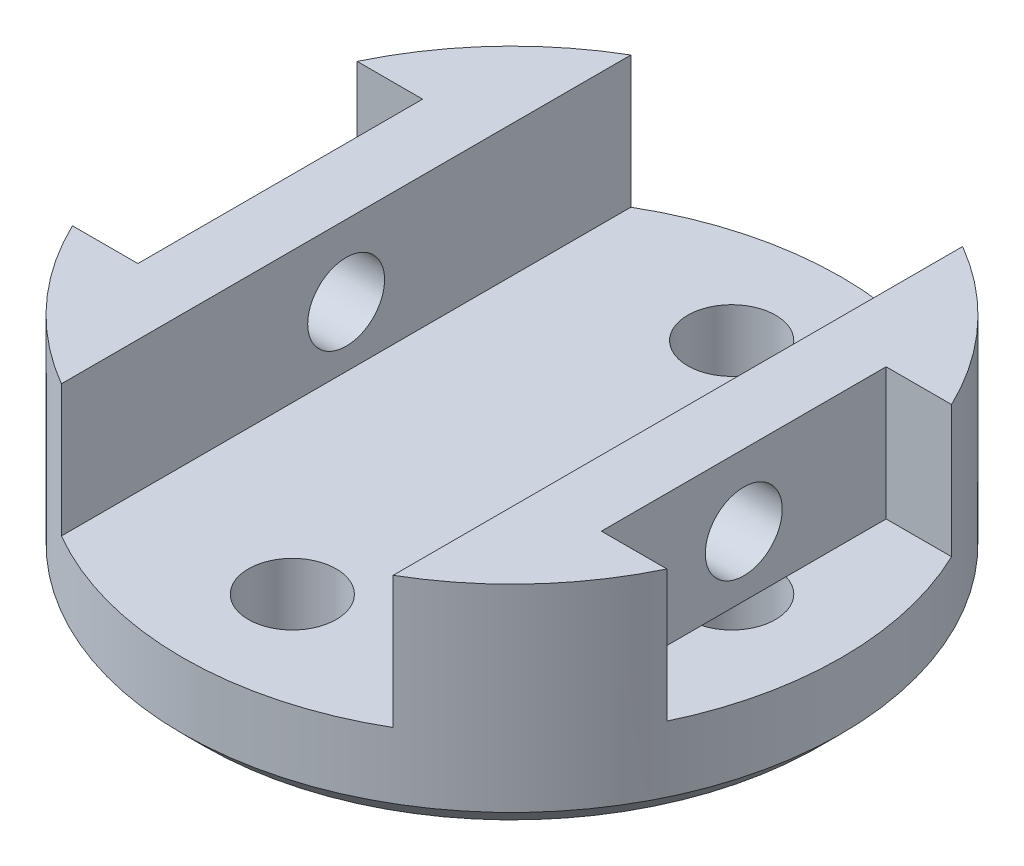
ISO-10303-21;
HEADER;
FILE_DESCRIPTION(('STEP AP214'),'2;1');
FILE_NAME('part.step','',(''),(''),'','','');
FILE_SCHEMA(('AUTOMOTIVE_DESIGN { 1 0 10303 214 1 1 1 1 }'));
ENDSEC;
DATA;
#1=APPLICATION_CONTEXT('core data for automotive mechanical design processes');
#2=APPLICATION_PROTOCOL_DEFINITION('international standard','automotive_design',2000,#1);
#3=PRODUCT_CONTEXT('',#1,'mechanical');
#4=PRODUCT('Part','Part','',(#3));
#5=PRODUCT_RELATED_PRODUCT_CATEGORY('part','',(#4));
#6=PRODUCT_DEFINITION_FORMATION('','',#4);
#7=PRODUCT_DEFINITION_CONTEXT('part definition',#1,'design');
#8=PRODUCT_DEFINITION('design','',#6,#7);
#9=PRODUCT_DEFINITION_SHAPE('','',#8);
#10=(LENGTH_UNIT() NAMED_UNIT(*) SI_UNIT(.MILLI.,.METRE.));
#11=(NAMED_UNIT(*) PLANE_ANGLE_UNIT() SI_UNIT($,.RADIAN.));
#12=(NAMED_UNIT(*) SI_UNIT($,.STERADIAN.) SOLID_ANGLE_UNIT());
#13=UNCERTAINTY_MEASURE_WITH_UNIT(LENGTH_MEASURE(1.E-05),#10,'distance_accuracy_value','');
#14=(GEOMETRIC_REPRESENTATION_CONTEXT(3) GLOBAL_UNCERTAINTY_ASSIGNED_CONTEXT((#13)) GLOBAL_UNIT_ASSIGNED_CONTEXT((#10,
#11,#12)) REPRESENTATION_CONTEXT('',''));
#15=CARTESIAN_POINT('',(0.,0.,0.));
#16=DIRECTION('',(0.,0.,1.));
#17=DIRECTION('',(1.,0.,0.));
#18=AXIS2_PLACEMENT_3D('',#15,#16,#17);
#19=CARTESIAN_POINT('',(0.,4.,0.));
#20=DIRECTION('',(0.,-1.,0.));
#21=DIRECTION('',(0.,0.,-1.));
#22=AXIS2_PLACEMENT_3D('',#19,#20,#21);
#23=CYLINDRICAL_SURFACE('',#22,15.);
#24=CARTESIAN_POINT('',(0.,1.00000000000001,0.));
#25=DIRECTION('',(0.,1.,0.));
#26=DIRECTION('',(0.,0.,1.));
#27=AXIS2_PLACEMENT_3D('',#24,#25,#26);
#28=CIRCLE('',#27,15.);
#29=CARTESIAN_POINT('',(0.,1.00000000000001,15.));
#30=VERTEX_POINT('',#29);
#31=EDGE_CURVE('E239',#30,#30,#28,.T.);
#32=ORIENTED_EDGE('',*,*,#31,.T.);
#33=EDGE_LOOP('',(#32));
#34=FACE_BOUND('',#33,.T.);
#35=CARTESIAN_POINT('',(0.,10.,0.));
#36=DIRECTION('',(0.,1.,0.));
#37=DIRECTION('',(0.,0.,1.));
#38=AXIS2_PLACEMENT_3D('',#35,#36,#37);
#39=CIRCLE('',#38,15.);
#40=CARTESIAN_POINT('',(7.55,10.,12.9613849568632));
#41=VERTEX_POINT('',#40);
#42=CARTESIAN_POINT('',(13.5277723591137,10.,6.4806924784316));
#43=VERTEX_POINT('',#42);
#44=EDGE_CURVE('E280',#41,#43,#39,.T.);
#45=ORIENTED_EDGE('',*,*,#44,.F.);
#46=DIRECTION('',(0.,-1.,0.));
#47=VECTOR('',#46,1.);
#48=CARTESIAN_POINT('',(7.55,14.,12.9613849568632));
#49=LINE('',#48,#47);
#50=CARTESIAN_POINT('',(7.55,4.,12.9613849568632));
#51=VERTEX_POINT('',#50);
#52=EDGE_CURVE('E209',#41,#51,#49,.T.);
#53=ORIENTED_EDGE('',*,*,#52,.T.);
#54=CARTESIAN_POINT('',(0.,4.,0.));
#55=DIRECTION('',(0.,1.,0.));
#56=DIRECTION('',(0.,0.,1.));
#57=AXIS2_PLACEMENT_3D('',#54,#55,#56);
#58=CIRCLE('',#57,15.);
#59=CARTESIAN_POINT('',(-7.55,4.,12.9613849568632));
#60=VERTEX_POINT('',#59);
#61=EDGE_CURVE('E236',#60,#51,#58,.T.);
#62=ORIENTED_EDGE('',*,*,#61,.F.);
#63=DIRECTION('',(0.,-1.,0.));
#64=VECTOR('',#63,1.);
#65=CARTESIAN_POINT('',(-7.55,14.,12.9613849568632));
#66=LINE('',#65,#64);
#67=CARTESIAN_POINT('',(-7.55,10.,12.9613849568632));
#68=VERTEX_POINT('',#67);
#69=EDGE_CURVE('E223',#68,#60,#66,.T.);
#70=ORIENTED_EDGE('',*,*,#69,.F.);
#71=CARTESIAN_POINT('',(-13.5277723591137,10.,6.4806924784316));
#72=VERTEX_POINT('',#71);
#73=EDGE_CURVE('E276',#72,#68,#39,.T.);
#74=ORIENTED_EDGE('',*,*,#73,.F.);
#75=DIRECTION('',(0.,-1.,0.));
#76=VECTOR('',#75,1.);
#77=CARTESIAN_POINT('',(-13.5277723591137,4.,6.4806924784316));
#78=LINE('',#77,#76);
#79=CARTESIAN_POINT('',(-13.5277723591137,4.,6.4806924784316));
#80=VERTEX_POINT('',#79);
#81=EDGE_CURVE('E155',#72,#80,#78,.T.);
#82=ORIENTED_EDGE('',*,*,#81,.T.);
#83=CARTESIAN_POINT('',(0.,4.,0.));
#84=DIRECTION('',(0.,-1.,0.));
#85=DIRECTION('',(0.,0.,-1.));
#86=AXIS2_PLACEMENT_3D('',#83,#84,#85);
#87=CIRCLE('',#86,15.);
#88=CARTESIAN_POINT('',(-13.5277723591137,4.,-6.48069247843161));
#89=VERTEX_POINT('',#88);
#90=EDGE_CURVE('E52',#80,#89,#87,.T.);
#91=ORIENTED_EDGE('',*,*,#90,.T.);
#92=DIRECTION('',(0.,-1.,0.));
#93=VECTOR('',#92,1.);
#94=CARTESIAN_POINT('',(-13.5277723591137,4.,-6.48069247843161));
#95=LINE('',#94,#93);
#96=CARTESIAN_POINT('',(-13.5277723591137,10.,-6.48069247843161));
#97=VERTEX_POINT('',#96);
#98=EDGE_CURVE('E178',#89,#97,#95,.F.);
#99=ORIENTED_EDGE('',*,*,#98,.T.);
#100=CARTESIAN_POINT('',(-7.55,10.,-12.9613849568632));
#101=VERTEX_POINT('',#100);
#102=EDGE_CURVE('E278',#101,#97,#39,.T.);
#103=ORIENTED_EDGE('',*,*,#102,.F.);
#104=DIRECTION('',(0.,-1.,0.));
#105=VECTOR('',#104,1.);
#106=CARTESIAN_POINT('',(-7.55,14.,-12.9613849568632));
#107=LINE('',#106,#105);
#108=CARTESIAN_POINT('',(-7.55,4.,-12.9613849568632));
#109=VERTEX_POINT('',#108);
#110=EDGE_CURVE('E221',#101,#109,#107,.T.);
#111=ORIENTED_EDGE('',*,*,#110,.T.);
#112=CARTESIAN_POINT('',(7.55,4.,-12.9613849568632));
#113=VERTEX_POINT('',#112);
#114=EDGE_CURVE('E240',#113,#109,#58,.T.);
#115=ORIENTED_EDGE('',*,*,#114,.F.);
#116=DIRECTION('',(0.,-1.,0.));
#117=VECTOR('',#116,1.);
#118=CARTESIAN_POINT('',(7.55,14.,-12.9613849568632));
#119=LINE('',#118,#117);
#120=CARTESIAN_POINT('',(7.55,10.,-12.9613849568632));
#121=VERTEX_POINT('',#120);
#122=EDGE_CURVE('E207',#121,#113,#119,.T.);
#123=ORIENTED_EDGE('',*,*,#122,.F.);
#124=CARTESIAN_POINT('',(13.5277723591137,10.,-6.48069247843161));
#125=VERTEX_POINT('',#124);
#126=EDGE_CURVE('E288',#125,#121,#39,.T.);
#127=ORIENTED_EDGE('',*,*,#126,.F.);
#128=DIRECTION('',(0.,-1.,0.));
#129=VECTOR('',#128,1.);
#130=CARTESIAN_POINT('',(13.5277723591137,4.,-6.48069247843161));
#131=LINE('',#130,#129);
#132=CARTESIAN_POINT('',(13.5277723591137,4.,-6.48069247843161));
#133=VERTEX_POINT('',#132);
#134=EDGE_CURVE('E200',#133,#125,#131,.F.);
#135=ORIENTED_EDGE('',*,*,#134,.F.);
#136=CARTESIAN_POINT('',(0.,4.,0.));
#137=DIRECTION('',(0.,-1.,0.));
#138=DIRECTION('',(0.,0.,-1.));
#139=AXIS2_PLACEMENT_3D('',#136,#137,#138);
#140=CIRCLE('',#139,15.);
#141=CARTESIAN_POINT('',(13.5277723591137,4.,6.4806924784316));
#142=VERTEX_POINT('',#141);
#143=EDGE_CURVE('E257',#133,#142,#140,.T.);
#144=ORIENTED_EDGE('',*,*,#143,.T.);
#145=DIRECTION('',(0.,-1.,0.));
#146=VECTOR('',#145,1.);
#147=CARTESIAN_POINT('',(13.5277723591137,4.,6.4806924784316));
#148=LINE('',#147,#146);
#149=EDGE_CURVE('E198',#43,#142,#148,.T.);
#150=ORIENTED_EDGE('',*,*,#149,.F.);
#151=EDGE_LOOP('',(#45,#53,#62,#70,#74,#82,#91,#99,#103,#111,#115,#123,#127,#135,#144,#150));
#152=FACE_BOUND('',#151,.T.);
#153=ADVANCED_FACE('F43',(#34,#152),#23,.T.);
#154=CARTESIAN_POINT('',(-7.55,14.,-0.96824583655187));
#155=DIRECTION('',(-1.,0.,0.));
#156=DIRECTION('',(0.,0.,1.));
#157=AXIS2_PLACEMENT_3D('',#154,#155,#156);
#158=PLANE('',#157);
#159=CARTESIAN_POINT('',(-7.55,6.75,0.));
#160=DIRECTION('',(-1.,0.,0.));
#161=DIRECTION('',(0.,0.,1.));
#162=AXIS2_PLACEMENT_3D('',#159,#160,#161);
#163=CIRCLE('',#162,1.75);
#164=CARTESIAN_POINT('',(-7.55,6.75,1.75));
#165=VERTEX_POINT('',#164);
#166=EDGE_CURVE('E204',#165,#165,#163,.T.);
#167=ORIENTED_EDGE('',*,*,#166,.T.);
#168=EDGE_LOOP('',(#167));
#169=FACE_BOUND('',#168,.T.);
#170=DIRECTION('',(0.,0.,-1.));
#171=VECTOR('',#170,1.);
#172=CARTESIAN_POINT('',(-7.55,10.,-0.96824583655187));
#173=LINE('',#172,#171);
#174=EDGE_CURVE('E282',#68,#101,#173,.T.);
#175=ORIENTED_EDGE('',*,*,#174,.F.);
#176=ORIENTED_EDGE('',*,*,#69,.T.);
#177=DIRECTION('',(0.,0.,-1.));
#178=VECTOR('',#177,1.);
#179=CARTESIAN_POINT('',(-7.55,4.,-0.96824583655187));
#180=LINE('',#179,#178);
#181=EDGE_CURVE('E218',#60,#109,#180,.T.);
#182=ORIENTED_EDGE('',*,*,#181,.T.);
#183=ORIENTED_EDGE('',*,*,#110,.F.);
#184=EDGE_LOOP('',(#175,#176,#182,#183));
#185=FACE_BOUND('',#184,.T.);
#186=ADVANCED_FACE('F297',(#169,#185),#158,.F.);
#187=CARTESIAN_POINT('',(7.55,14.,12.9613849568632));
#188=DIRECTION('',(1.,0.,0.));
#189=DIRECTION('',(0.,0.,-1.));
#190=AXIS2_PLACEMENT_3D('',#187,#188,#189);
#191=PLANE('',#190);
#192=CARTESIAN_POINT('',(7.54999999999999,6.75,0.));
#193=DIRECTION('',(1.,0.,0.));
#194=DIRECTION('',(0.,0.,-1.));
#195=AXIS2_PLACEMENT_3D('',#192,#193,#194);
#196=CIRCLE('',#195,1.75);
#197=CARTESIAN_POINT('',(7.54999999999999,6.75,-1.75));
#198=VERTEX_POINT('',#197);
#199=EDGE_CURVE('E203',#198,#198,#196,.T.);
#200=ORIENTED_EDGE('',*,*,#199,.T.);
#201=EDGE_LOOP('',(#200));
#202=FACE_BOUND('',#201,.T.);
#203=DIRECTION('',(0.,0.,1.));
#204=VECTOR('',#203,1.);
#205=CARTESIAN_POINT('',(7.55,10.,12.9613849568632));
#206=LINE('',#205,#204);
#207=EDGE_CURVE('E169',#121,#41,#206,.T.);
#208=ORIENTED_EDGE('',*,*,#207,.F.);
#209=ORIENTED_EDGE('',*,*,#122,.T.);
#210=DIRECTION('',(0.,0.,1.));
#211=VECTOR('',#210,1.);
#212=CARTESIAN_POINT('',(7.55,4.,12.9613849568632));
#213=LINE('',#212,#211);
#214=EDGE_CURVE('E211',#113,#51,#213,.T.);
#215=ORIENTED_EDGE('',*,*,#214,.T.);
#216=ORIENTED_EDGE('',*,*,#52,.F.);
#217=EDGE_LOOP('',(#208,#209,#215,#216));
#218=FACE_BOUND('',#217,.T.);
#219=ADVANCED_FACE('F307',(#202,#218),#191,.F.);
#220=CARTESIAN_POINT('',(-8.82062918766411,0.,-6.48069247843161));
#221=DIRECTION('',(0.,0.,1.));
#222=DIRECTION('',(1.,0.,0.));
#223=AXIS2_PLACEMENT_3D('',#220,#221,#222);
#224=PLANE('',#223);
#225=ORIENTED_EDGE('',*,*,#134,.T.);
#226=DIRECTION('',(-1.,0.,0.));
#227=VECTOR('',#226,1.);
#228=CARTESIAN_POINT('',(-8.82062918766411,10.,-6.48069247843161));
#229=LINE('',#228,#227);
#230=CARTESIAN_POINT('',(10.55,10.,-6.48069247843161));
#231=VERTEX_POINT('',#230);
#232=EDGE_CURVE('E286',#125,#231,#229,.T.);
#233=ORIENTED_EDGE('',*,*,#232,.T.);
#234=DIRECTION('',(0.,1.,0.));
#235=VECTOR('',#234,1.);
#236=CARTESIAN_POINT('',(10.55,0.,-6.48069247843161));
#237=LINE('',#236,#235);
#238=CARTESIAN_POINT('',(10.55,4.,-6.48069247843161));
#239=VERTEX_POINT('',#238);
#240=EDGE_CURVE('E185',#239,#231,#237,.T.);
#241=ORIENTED_EDGE('',*,*,#240,.F.);
#242=DIRECTION('',(1.,0.,0.));
#243=VECTOR('',#242,1.);
#244=CARTESIAN_POINT('',(-8.82062918766411,4.,-6.48069247843161));
#245=LINE('',#244,#243);
#246=EDGE_CURVE('E181',#239,#133,#245,.T.);
#247=ORIENTED_EDGE('',*,*,#246,.T.);
#248=EDGE_LOOP('',(#225,#233,#241,#247));
#249=FACE_BOUND('',#248,.T.);
#250=ADVANCED_FACE('F310',(#249),#224,.T.);
#251=CARTESIAN_POINT('',(-8.82062918766411,0.,6.4806924784316));
#252=DIRECTION('',(0.,0.,-1.));
#253=DIRECTION('',(-1.,0.,0.));
#254=AXIS2_PLACEMENT_3D('',#251,#252,#253);
#255=PLANE('',#254);
#256=DIRECTION('',(0.,-1.,0.));
#257=VECTOR('',#256,1.);
#258=CARTESIAN_POINT('',(10.55,0.,6.4806924784316));
#259=LINE('',#258,#257);
#260=CARTESIAN_POINT('',(10.55,10.,6.4806924784316));
#261=VERTEX_POINT('',#260);
#262=CARTESIAN_POINT('',(10.55,4.,6.4806924784316));
#263=VERTEX_POINT('',#262);
#264=EDGE_CURVE('E182',#261,#263,#259,.T.);
#265=ORIENTED_EDGE('',*,*,#264,.F.);
#266=DIRECTION('',(1.,0.,0.));
#267=VECTOR('',#266,1.);
#268=CARTESIAN_POINT('',(-8.82062918766411,10.,6.4806924784316));
#269=LINE('',#268,#267);
#270=EDGE_CURVE('E59',#261,#43,#269,.T.);
#271=ORIENTED_EDGE('',*,*,#270,.T.);
#272=ORIENTED_EDGE('',*,*,#149,.T.);
#273=DIRECTION('',(1.,0.,0.));
#274=VECTOR('',#273,1.);
#275=CARTESIAN_POINT('',(-8.82062918766411,4.,6.4806924784316));
#276=LINE('',#275,#274);
#277=EDGE_CURVE('E191',#263,#142,#276,.T.);
#278=ORIENTED_EDGE('',*,*,#277,.F.);
#279=EDGE_LOOP('',(#265,#271,#272,#278));
#280=FACE_BOUND('',#279,.T.);
#281=ADVANCED_FACE('F320',(#280),#255,.T.);
#282=CARTESIAN_POINT('',(10.55,14.,12.9613849568632));
#283=DIRECTION('',(1.,0.,0.));
#284=DIRECTION('',(0.,0.,-1.));
#285=AXIS2_PLACEMENT_3D('',#282,#283,#284);
#286=PLANE('',#285);
#287=CARTESIAN_POINT('',(10.55,6.75,0.));
#288=DIRECTION('',(1.,0.,0.));
#289=DIRECTION('',(0.,0.,-1.));
#290=AXIS2_PLACEMENT_3D('',#287,#288,#289);
#291=CIRCLE('',#290,1.75);
#292=CARTESIAN_POINT('',(10.55,6.75,-1.75));
#293=VERTEX_POINT('',#292);
#294=EDGE_CURVE('E189',#293,#293,#291,.F.);
#295=ORIENTED_EDGE('',*,*,#294,.T.);
#296=EDGE_LOOP('',(#295));
#297=FACE_BOUND('',#296,.T.);
#298=ORIENTED_EDGE('',*,*,#240,.T.);
#299=DIRECTION('',(0.,0.,1.));
#300=VECTOR('',#299,1.);
#301=CARTESIAN_POINT('',(10.55,10.,12.9613849568632));
#302=LINE('',#301,#300);
#303=EDGE_CURVE('E284',#231,#261,#302,.T.);
#304=ORIENTED_EDGE('',*,*,#303,.T.);
#305=ORIENTED_EDGE('',*,*,#264,.T.);
#306=DIRECTION('',(0.,0.,1.));
#307=VECTOR('',#306,1.);
#308=CARTESIAN_POINT('',(10.55,4.,0.));
#309=LINE('',#308,#307);
#310=CARTESIAN_POINT('',(10.55,4.,1.92288845230301));
#311=VERTEX_POINT('',#310);
#312=EDGE_CURVE('E184',#311,#263,#309,.T.);
#313=ORIENTED_EDGE('',*,*,#312,.F.);
#314=CARTESIAN_POINT('',(10.55,4.,-1.92288845230287));
#315=VERTEX_POINT('',#314);
#316=EDGE_CURVE('E190',#315,#311,#309,.T.);
#317=ORIENTED_EDGE('',*,*,#316,.F.);
#318=EDGE_CURVE('E186',#239,#315,#309,.T.);
#319=ORIENTED_EDGE('',*,*,#318,.F.);
#320=EDGE_LOOP('',(#298,#304,#305,#313,#317,#319));
#321=FACE_BOUND('',#320,.T.);
#322=ADVANCED_FACE('F322',(#297,#321),#286,.T.);
#323=CARTESIAN_POINT('',(8.82062918766411,4.,-6.48069247843161));
#324=DIRECTION('',(0.,0.,-1.));
#325=DIRECTION('',(-1.,0.,0.));
#326=AXIS2_PLACEMENT_3D('',#323,#324,#325);
#327=PLANE('',#326);
#328=DIRECTION('',(1.,0.,0.));
#329=VECTOR('',#328,1.);
#330=CARTESIAN_POINT('',(8.82062918766411,10.,-6.48069247843161));
#331=LINE('',#330,#329);
#332=CARTESIAN_POINT('',(-10.55,10.,-6.48069247843161));
#333=VERTEX_POINT('',#332);
#334=EDGE_CURVE('E67',#97,#333,#331,.T.);
#335=ORIENTED_EDGE('',*,*,#334,.F.);
#336=ORIENTED_EDGE('',*,*,#98,.F.);
#337=DIRECTION('',(-1.,0.,0.));
#338=VECTOR('',#337,1.);
#339=CARTESIAN_POINT('',(8.82062918766411,4.,-6.48069247843161));
#340=LINE('',#339,#338);
#341=CARTESIAN_POINT('',(-10.55,4.,-6.48069247843161));
#342=VERTEX_POINT('',#341);
#343=EDGE_CURVE('E166',#342,#89,#340,.T.);
#344=ORIENTED_EDGE('',*,*,#343,.F.);
#345=DIRECTION('',(0.,1.,0.));
#346=VECTOR('',#345,1.);
#347=CARTESIAN_POINT('',(-10.55,4.,-6.48069247843161));
#348=LINE('',#347,#346);
#349=EDGE_CURVE('E161',#342,#333,#348,.T.);
#350=ORIENTED_EDGE('',*,*,#349,.T.);
#351=EDGE_LOOP('',(#335,#336,#344,#350));
#352=FACE_BOUND('',#351,.T.);
#353=ADVANCED_FACE('F275',(#352),#327,.F.);
#354=CARTESIAN_POINT('',(8.82062918766411,4.,6.4806924784316));
#355=DIRECTION('',(0.,0.,1.));
#356=DIRECTION('',(1.,0.,0.));
#357=AXIS2_PLACEMENT_3D('',#354,#355,#356);
#358=PLANE('',#357);
#359=DIRECTION('',(-1.,0.,0.));
#360=VECTOR('',#359,1.);
#361=CARTESIAN_POINT('',(8.82062918766411,10.,6.4806924784316));
#362=LINE('',#361,#360);
#363=CARTESIAN_POINT('',(-10.55,10.,6.4806924784316));
#364=VERTEX_POINT('',#363);
#365=EDGE_CURVE('E143',#364,#72,#362,.T.);
#366=ORIENTED_EDGE('',*,*,#365,.F.);
#367=DIRECTION('',(0.,-1.,0.));
#368=VECTOR('',#367,1.);
#369=CARTESIAN_POINT('',(-10.55,4.,6.4806924784316));
#370=LINE('',#369,#368);
#371=CARTESIAN_POINT('',(-10.55,4.,6.4806924784316));
#372=VERTEX_POINT('',#371);
#373=EDGE_CURVE('E153',#364,#372,#370,.T.);
#374=ORIENTED_EDGE('',*,*,#373,.T.);
#375=DIRECTION('',(-1.,0.,0.));
#376=VECTOR('',#375,1.);
#377=CARTESIAN_POINT('',(8.82062918766411,4.,6.4806924784316));
#378=LINE('',#377,#376);
#379=EDGE_CURVE('E162',#372,#80,#378,.T.);
#380=ORIENTED_EDGE('',*,*,#379,.T.);
#381=ORIENTED_EDGE('',*,*,#81,.F.);
#382=EDGE_LOOP('',(#366,#374,#380,#381));
#383=FACE_BOUND('',#382,.T.);
#384=ADVANCED_FACE('F151',(#383),#358,.F.);
#385=CARTESIAN_POINT('',(-10.55,14.,-0.96824583655187));
#386=DIRECTION('',(-1.,0.,0.));
#387=DIRECTION('',(0.,0.,1.));
#388=AXIS2_PLACEMENT_3D('',#385,#386,#387);
#389=PLANE('',#388);
#390=CARTESIAN_POINT('',(-10.55,6.75,0.));
#391=DIRECTION('',(-1.,0.,0.));
#392=DIRECTION('',(0.,0.,1.));
#393=AXIS2_PLACEMENT_3D('',#390,#391,#392);
#394=CIRCLE('',#393,1.75);
#395=CARTESIAN_POINT('',(-10.55,6.75,1.75));
#396=VERTEX_POINT('',#395);
#397=EDGE_CURVE('E175',#396,#396,#394,.F.);
#398=ORIENTED_EDGE('',*,*,#397,.T.);
#399=EDGE_LOOP('',(#398));
#400=FACE_BOUND('',#399,.T.);
#401=ORIENTED_EDGE('',*,*,#373,.F.);
#402=DIRECTION('',(0.,0.,-1.));
#403=VECTOR('',#402,1.);
#404=CARTESIAN_POINT('',(-10.55,10.,-0.96824583655187));
#405=LINE('',#404,#403);
#406=EDGE_CURVE('E12',#364,#333,#405,.T.);
#407=ORIENTED_EDGE('',*,*,#406,.T.);
#408=ORIENTED_EDGE('',*,*,#349,.F.);
#409=DIRECTION('',(0.,0.,-1.));
#410=VECTOR('',#409,1.);
#411=CARTESIAN_POINT('',(-10.55,4.,-6.48069247843161));
#412=LINE('',#411,#410);
#413=CARTESIAN_POINT('',(-10.55,4.,-1.92288845230294));
#414=VERTEX_POINT('',#413);
#415=EDGE_CURVE('E164',#414,#342,#412,.T.);
#416=ORIENTED_EDGE('',*,*,#415,.F.);
#417=CARTESIAN_POINT('',(-10.55,4.,1.92288845230294));
#418=VERTEX_POINT('',#417);
#419=EDGE_CURVE('E176',#418,#414,#412,.T.);
#420=ORIENTED_EDGE('',*,*,#419,.F.);
#421=EDGE_CURVE('E160',#372,#418,#412,.T.);
#422=ORIENTED_EDGE('',*,*,#421,.F.);
#423=EDGE_LOOP('',(#401,#407,#408,#416,#420,#422));
#424=FACE_BOUND('',#423,.T.);
#425=ADVANCED_FACE('F158',(#400,#424),#389,.T.);
#426=CARTESIAN_POINT('',(-15.,6.75,0.));
#427=DIRECTION('',(1.,0.,0.));
#428=DIRECTION('',(0.,0.,-1.));
#429=AXIS2_PLACEMENT_3D('',#426,#427,#428);
#430=CYLINDRICAL_SURFACE('',#429,1.75);
#431=ORIENTED_EDGE('',*,*,#166,.F.);
#432=EDGE_LOOP('',(#431));
#433=FACE_BOUND('',#432,.T.);
#434=ORIENTED_EDGE('',*,*,#397,.F.);
#435=EDGE_LOOP('',(#434));
#436=FACE_BOUND('',#435,.T.);
#437=ADVANCED_FACE('F363',(#433,#436),#430,.F.);
#438=ORIENTED_EDGE('',*,*,#199,.F.);
#439=EDGE_LOOP('',(#438));
#440=FACE_BOUND('',#439,.T.);
#441=ORIENTED_EDGE('',*,*,#294,.F.);
#442=EDGE_LOOP('',(#441));
#443=FACE_BOUND('',#442,.T.);
#444=ADVANCED_FACE('F358',(#440,#443),#430,.F.);
#445=CARTESIAN_POINT('',(0.,4.,0.));
#446=DIRECTION('',(0.,1.,0.));
#447=DIRECTION('',(0.,0.,1.));
#448=AXIS2_PLACEMENT_3D('',#445,#446,#447);
#449=PLANE('',#448);
#450=CARTESIAN_POINT('',(-1.05254516842123E-13,4.,10.));
#451=DIRECTION('',(0.,1.,0.));
#452=DIRECTION('',(0.,0.,1.));
#453=AXIS2_PLACEMENT_3D('',#450,#451,#452);
#454=CIRCLE('',#453,2.);
#455=CARTESIAN_POINT('',(-1.05254516842123E-13,4.,12.));
#456=VERTEX_POINT('',#455);
#457=EDGE_CURVE('E229',#456,#456,#454,.T.);
#458=ORIENTED_EDGE('',*,*,#457,.F.);
#459=EDGE_LOOP('',(#458));
#460=FACE_BOUND('',#459,.T.);
#461=CARTESIAN_POINT('',(0.,4.,-10.));
#462=DIRECTION('',(0.,1.,0.));
#463=DIRECTION('',(0.,0.,1.));
#464=AXIS2_PLACEMENT_3D('',#461,#462,#463);
#465=CIRCLE('',#464,2.);
#466=CARTESIAN_POINT('',(0.,4.,-8.));
#467=VERTEX_POINT('',#466);
#468=EDGE_CURVE('E230',#467,#467,#465,.T.);
#469=ORIENTED_EDGE('',*,*,#468,.F.);
#470=EDGE_LOOP('',(#469));
#471=FACE_BOUND('',#470,.T.);
#472=ORIENTED_EDGE('',*,*,#61,.T.);
#473=ORIENTED_EDGE('',*,*,#214,.F.);
#474=ORIENTED_EDGE('',*,*,#114,.T.);
#475=ORIENTED_EDGE('',*,*,#181,.F.);
#476=EDGE_LOOP('',(#472,#473,#474,#475));
#477=FACE_BOUND('',#476,.T.);
#478=ADVANCED_FACE('F302',(#460,#471,#477),#449,.T.);
#479=CARTESIAN_POINT('',(0.,0.,0.));
#480=DIRECTION('',(0.,1.,0.));
#481=DIRECTION('',(0.,0.,1.));
#482=AXIS2_PLACEMENT_3D('',#479,#480,#481);
#483=PLANE('',#482);
#484=CARTESIAN_POINT('',(0.,0.,0.));
#485=DIRECTION('',(0.,1.,0.));
#486=DIRECTION('',(0.,0.,1.));
#487=AXIS2_PLACEMENT_3D('',#484,#485,#486);
#488=CIRCLE('',#487,14.);
#489=CARTESIAN_POINT('',(0.,0.,14.));
#490=VERTEX_POINT('',#489);
#491=EDGE_CURVE('E254',#490,#490,#488,.F.);
#492=ORIENTED_EDGE('',*,*,#491,.T.);
#493=EDGE_LOOP('',(#492));
#494=FACE_BOUND('',#493,.T.);
#495=CARTESIAN_POINT('',(-10.,0.,0.));
#496=DIRECTION('',(0.,1.,0.));
#497=DIRECTION('',(0.,0.,1.));
#498=AXIS2_PLACEMENT_3D('',#495,#496,#497);
#499=CIRCLE('',#498,2.);
#500=CARTESIAN_POINT('',(-10.,0.,2.));
#501=VERTEX_POINT('',#500);
#502=EDGE_CURVE('E249',#501,#501,#499,.T.);
#503=ORIENTED_EDGE('',*,*,#502,.T.);
#504=EDGE_LOOP('',(#503));
#505=FACE_BOUND('',#504,.T.);
#506=CARTESIAN_POINT('',(0.,0.,-10.));
#507=DIRECTION('',(0.,1.,0.));
#508=DIRECTION('',(0.,0.,1.));
#509=AXIS2_PLACEMENT_3D('',#506,#507,#508);
#510=CIRCLE('',#509,2.);
#511=CARTESIAN_POINT('',(0.,0.,-8.));
#512=VERTEX_POINT('',#511);
#513=EDGE_CURVE('E246',#512,#512,#510,.T.);
#514=ORIENTED_EDGE('',*,*,#513,.T.);
#515=EDGE_LOOP('',(#514));
#516=FACE_BOUND('',#515,.T.);
#517=CARTESIAN_POINT('',(10.,0.,0.));
#518=DIRECTION('',(0.,1.,0.));
#519=DIRECTION('',(0.,0.,1.));
#520=AXIS2_PLACEMENT_3D('',#517,#518,#519);
#521=CIRCLE('',#520,2.);
#522=CARTESIAN_POINT('',(10.,0.,2.00000000000007));
#523=VERTEX_POINT('',#522);
#524=EDGE_CURVE('E243',#523,#523,#521,.T.);
#525=ORIENTED_EDGE('',*,*,#524,.T.);
#526=EDGE_LOOP('',(#525));
#527=FACE_BOUND('',#526,.T.);
#528=CARTESIAN_POINT('',(-1.05254516842123E-13,0.,10.));
#529=DIRECTION('',(0.,1.,0.));
#530=DIRECTION('',(0.,0.,1.));
#531=AXIS2_PLACEMENT_3D('',#528,#529,#530);
#532=CIRCLE('',#531,2.);
#533=CARTESIAN_POINT('',(-1.05254516842123E-13,0.,12.));
#534=VERTEX_POINT('',#533);
#535=EDGE_CURVE('E233',#534,#534,#532,.T.);
#536=ORIENTED_EDGE('',*,*,#535,.T.);
#537=EDGE_LOOP('',(#536));
#538=FACE_BOUND('',#537,.T.);
#539=ADVANCED_FACE('F337',(#494,#505,#516,#527,#538),#483,.F.);
#540=CARTESIAN_POINT('',(-1.05254516842123E-13,-1.,10.));
#541=DIRECTION('',(0.,1.,0.));
#542=DIRECTION('',(0.,0.,1.));
#543=AXIS2_PLACEMENT_3D('',#540,#541,#542);
#544=CYLINDRICAL_SURFACE('',#543,2.);
#545=ORIENTED_EDGE('',*,*,#457,.T.);
#546=EDGE_LOOP('',(#545));
#547=FACE_BOUND('',#546,.T.);
#548=ORIENTED_EDGE('',*,*,#535,.F.);
#549=EDGE_LOOP('',(#548));
#550=FACE_BOUND('',#549,.T.);
#551=ADVANCED_FACE('F333',(#547,#550),#544,.F.);
#552=CARTESIAN_POINT('',(10.,-1.,0.));
#553=DIRECTION('',(0.,1.,0.));
#554=DIRECTION('',(0.,0.,1.));
#555=AXIS2_PLACEMENT_3D('',#552,#553,#554);
#556=CYLINDRICAL_SURFACE('',#555,2.);
#557=CARTESIAN_POINT('',(10.,4.,0.));
#558=DIRECTION('',(0.,1.,0.));
#559=DIRECTION('',(0.,0.,1.));
#560=AXIS2_PLACEMENT_3D('',#557,#558,#559);
#561=CIRCLE('',#560,2.);
#562=EDGE_CURVE('E215',#315,#311,#561,.F.);
#563=ORIENTED_EDGE('',*,*,#562,.F.);
#564=EDGE_CURVE('E214',#311,#315,#561,.F.);
#565=ORIENTED_EDGE('',*,*,#564,.F.);
#566=EDGE_LOOP('',(#563,#565));
#567=FACE_BOUND('',#566,.T.);
#568=ORIENTED_EDGE('',*,*,#524,.F.);
#569=EDGE_LOOP('',(#568));
#570=FACE_BOUND('',#569,.T.);
#571=ADVANCED_FACE('F329',(#567,#570),#556,.F.);
#572=CARTESIAN_POINT('',(0.,-1.,-10.));
#573=DIRECTION('',(0.,1.,0.));
#574=DIRECTION('',(0.,0.,1.));
#575=AXIS2_PLACEMENT_3D('',#572,#573,#574);
#576=CYLINDRICAL_SURFACE('',#575,2.);
#577=ORIENTED_EDGE('',*,*,#468,.T.);
#578=EDGE_LOOP('',(#577));
#579=FACE_BOUND('',#578,.T.);
#580=ORIENTED_EDGE('',*,*,#513,.F.);
#581=EDGE_LOOP('',(#580));
#582=FACE_BOUND('',#581,.T.);
#583=ADVANCED_FACE('F332',(#579,#582),#576,.F.);
#584=CARTESIAN_POINT('',(-10.,-1.,0.));
#585=DIRECTION('',(0.,1.,0.));
#586=DIRECTION('',(0.,0.,1.));
#587=AXIS2_PLACEMENT_3D('',#584,#585,#586);
#588=CYLINDRICAL_SURFACE('',#587,2.);
#589=CARTESIAN_POINT('',(-10.,4.,0.));
#590=DIRECTION('',(0.,1.,0.));
#591=DIRECTION('',(0.,0.,1.));
#592=AXIS2_PLACEMENT_3D('',#589,#590,#591);
#593=CIRCLE('',#592,2.);
#594=EDGE_CURVE('E226',#414,#418,#593,.T.);
#595=ORIENTED_EDGE('',*,*,#594,.T.);
#596=EDGE_CURVE('E225',#418,#414,#593,.T.);
#597=ORIENTED_EDGE('',*,*,#596,.T.);
#598=EDGE_LOOP('',(#595,#597));
#599=FACE_BOUND('',#598,.T.);
#600=ORIENTED_EDGE('',*,*,#502,.F.);
#601=EDGE_LOOP('',(#600));
#602=FACE_BOUND('',#601,.T.);
#603=ADVANCED_FACE('F372',(#599,#602),#588,.F.);
#604=CARTESIAN_POINT('',(0.,4.,0.));
#605=DIRECTION('',(0.,1.,0.));
#606=DIRECTION('',(0.,0.,1.));
#607=AXIS2_PLACEMENT_3D('',#604,#605,#606);
#608=PLANE('',#607);
#609=ORIENTED_EDGE('',*,*,#596,.F.);
#610=ORIENTED_EDGE('',*,*,#419,.T.);
#611=EDGE_LOOP('',(#609,#610));
#612=FACE_BOUND('',#611,.T.);
#613=ADVANCED_FACE('F379',(#612),#608,.F.);
#614=CARTESIAN_POINT('',(0.,4.,0.));
#615=DIRECTION('',(0.,1.,0.));
#616=DIRECTION('',(0.,0.,1.));
#617=AXIS2_PLACEMENT_3D('',#614,#615,#616);
#618=PLANE('',#617);
#619=ORIENTED_EDGE('',*,*,#564,.T.);
#620=ORIENTED_EDGE('',*,*,#316,.T.);
#621=EDGE_LOOP('',(#619,#620));
#622=FACE_BOUND('',#621,.T.);
#623=ADVANCED_FACE('F327',(#622),#618,.F.);
#624=CARTESIAN_POINT('',(0.,1.00000000000001,0.));
#625=DIRECTION('',(0.,1.,0.));
#626=DIRECTION('',(0.,0.,1.));
#627=AXIS2_PLACEMENT_3D('',#624,#625,#626);
#628=CONICAL_SURFACE('',#627,15.,0.785398163397448);
#629=ORIENTED_EDGE('',*,*,#491,.F.);
#630=EDGE_LOOP('',(#629));
#631=FACE_BOUND('',#630,.T.);
#632=ORIENTED_EDGE('',*,*,#31,.F.);
#633=EDGE_LOOP('',(#632));
#634=FACE_BOUND('',#633,.T.);
#635=ADVANCED_FACE('F46',(#631,#634),#628,.T.);
#636=CARTESIAN_POINT('',(-8.82062918766411,4.,0.));
#637=DIRECTION('',(0.,-1.,0.));
#638=DIRECTION('',(0.,0.,-1.));
#639=AXIS2_PLACEMENT_3D('',#636,#637,#638);
#640=PLANE('',#639);
#641=ORIENTED_EDGE('',*,*,#562,.T.);
#642=ORIENTED_EDGE('',*,*,#312,.T.);
#643=ORIENTED_EDGE('',*,*,#277,.T.);
#644=ORIENTED_EDGE('',*,*,#143,.F.);
#645=ORIENTED_EDGE('',*,*,#246,.F.);
#646=ORIENTED_EDGE('',*,*,#318,.T.);
#647=EDGE_LOOP('',(#641,#642,#643,#644,#645,#646));
#648=FACE_BOUND('',#647,.T.);
#649=ADVANCED_FACE('F314',(#648),#640,.F.);
#650=CARTESIAN_POINT('',(8.82062918766411,4.,-6.48069247843161));
#651=DIRECTION('',(0.,-1.,0.));
#652=DIRECTION('',(0.,0.,-1.));
#653=AXIS2_PLACEMENT_3D('',#650,#651,#652);
#654=PLANE('',#653);
#655=ORIENTED_EDGE('',*,*,#415,.T.);
#656=ORIENTED_EDGE('',*,*,#343,.T.);
#657=ORIENTED_EDGE('',*,*,#90,.F.);
#658=ORIENTED_EDGE('',*,*,#379,.F.);
#659=ORIENTED_EDGE('',*,*,#421,.T.);
#660=ORIENTED_EDGE('',*,*,#594,.F.);
#661=EDGE_LOOP('',(#655,#656,#657,#658,#659,#660));
#662=FACE_BOUND('',#661,.T.);
#663=ADVANCED_FACE('F271',(#662),#654,.F.);
#664=CARTESIAN_POINT('',(0.,10.,0.));
#665=DIRECTION('',(0.,1.,0.));
#666=DIRECTION('',(0.,0.,1.));
#667=AXIS2_PLACEMENT_3D('',#664,#665,#666);
#668=PLANE('',#667);
#669=ORIENTED_EDGE('',*,*,#174,.T.);
#670=ORIENTED_EDGE('',*,*,#102,.T.);
#671=ORIENTED_EDGE('',*,*,#334,.T.);
#672=ORIENTED_EDGE('',*,*,#406,.F.);
#673=ORIENTED_EDGE('',*,*,#365,.T.);
#674=ORIENTED_EDGE('',*,*,#73,.T.);
#675=EDGE_LOOP('',(#669,#670,#671,#672,#673,#674));
#676=FACE_BOUND('',#675,.T.);
#677=ADVANCED_FACE('F142',(#676),#668,.T.);
#678=ORIENTED_EDGE('',*,*,#207,.T.);
#679=ORIENTED_EDGE('',*,*,#44,.T.);
#680=ORIENTED_EDGE('',*,*,#270,.F.);
#681=ORIENTED_EDGE('',*,*,#303,.F.);
#682=ORIENTED_EDGE('',*,*,#232,.F.);
#683=ORIENTED_EDGE('',*,*,#126,.T.);
#684=EDGE_LOOP('',(#678,#679,#680,#681,#682,#683));
#685=FACE_BOUND('',#684,.T.);
#686=ADVANCED_FACE('F411',(#685),#668,.T.);
#687=CLOSED_SHELL('',(#153,#186,#219,#250,#281,#322,#353,#384,#425,#437,#444,#478,#539,#551,
#571,#583,#603,#613,#623,#635,#649,#663,#677,#686));
#688=MANIFOLD_SOLID_BREP('B2',#687);
#689=ADVANCED_BREP_SHAPE_REPRESENTATION('',(#18,#688),#14);
#690=SHAPE_DEFINITION_REPRESENTATION(#9,#689);
ENDSEC;
END-ISO-10303-21;
